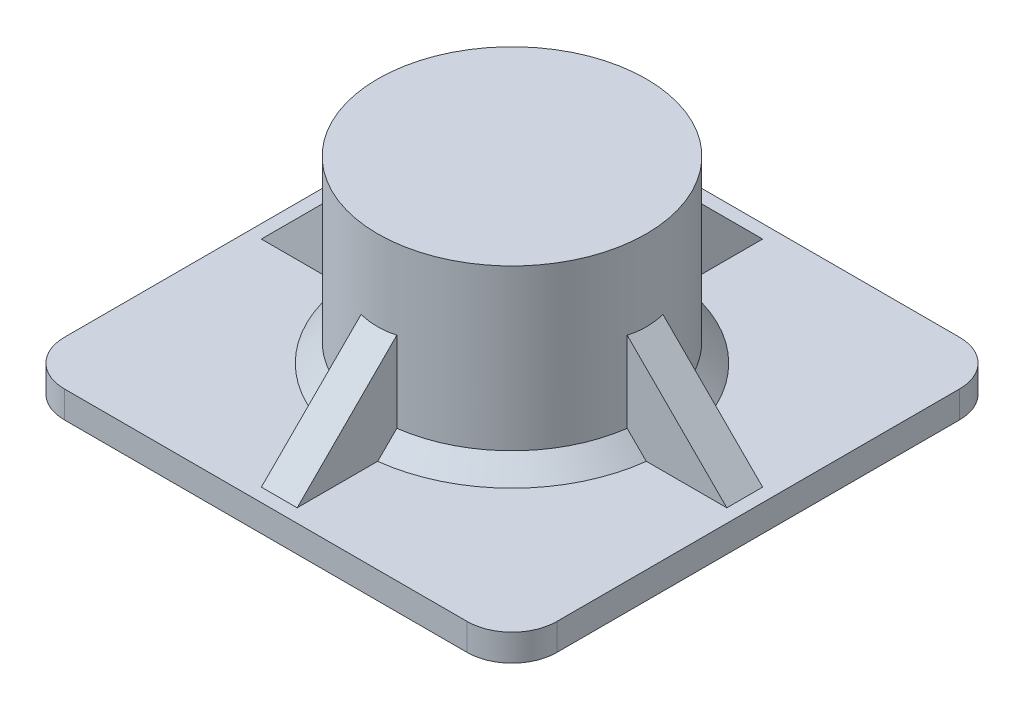
ISO-10303-21;
HEADER;
FILE_DESCRIPTION(('STEP AP214'),'2;1');
FILE_NAME('part.step','',(''),(''),'','','');
FILE_SCHEMA(('AUTOMOTIVE_DESIGN { 1 0 10303 214 1 1 1 1 }'));
ENDSEC;
DATA;
#1=APPLICATION_CONTEXT('core data for automotive mechanical design processes');
#2=APPLICATION_PROTOCOL_DEFINITION('international standard','automotive_design',2000,#1);
#3=PRODUCT_CONTEXT('',#1,'mechanical');
#4=PRODUCT('Part','Part','',(#3));
#5=PRODUCT_RELATED_PRODUCT_CATEGORY('part','',(#4));
#6=PRODUCT_DEFINITION_FORMATION('','',#4);
#7=PRODUCT_DEFINITION_CONTEXT('part definition',#1,'design');
#8=PRODUCT_DEFINITION('design','',#6,#7);
#9=PRODUCT_DEFINITION_SHAPE('','',#8);
#10=(LENGTH_UNIT() NAMED_UNIT(*) SI_UNIT(.MILLI.,.METRE.));
#11=(NAMED_UNIT(*) PLANE_ANGLE_UNIT() SI_UNIT($,.RADIAN.));
#12=(NAMED_UNIT(*) SI_UNIT($,.STERADIAN.) SOLID_ANGLE_UNIT());
#13=UNCERTAINTY_MEASURE_WITH_UNIT(LENGTH_MEASURE(1.E-05),#10,'distance_accuracy_value','');
#14=(GEOMETRIC_REPRESENTATION_CONTEXT(3) GLOBAL_UNCERTAINTY_ASSIGNED_CONTEXT((#13)) GLOBAL_UNIT_ASSIGNED_CONTEXT((#10,
#11,#12)) REPRESENTATION_CONTEXT('',''));
#15=CARTESIAN_POINT('',(0.,0.,0.));
#16=DIRECTION('',(0.,0.,1.));
#17=DIRECTION('',(1.,0.,0.));
#18=AXIS2_PLACEMENT_3D('',#15,#16,#17);
#19=CARTESIAN_POINT('',(0.,3.00000000000001,0.));
#20=DIRECTION('',(0.,-1.,0.));
#21=DIRECTION('',(1.,0.,0.));
#22=AXIS2_PLACEMENT_3D('',#19,#20,#21);
#23=CONICAL_SURFACE('',#22,17.1213203435597,0.785398163397456);
#24=CARTESIAN_POINT('',(0.,3.00000000000001,0.));
#25=DIRECTION('',(0.,-1.,0.));
#26=DIRECTION('',(1.,0.,0.));
#27=AXIS2_PLACEMENT_3D('',#24,#25,#26);
#28=CIRCLE('',#27,17.1213203435597);
#29=CARTESIAN_POINT('',(17.0041056897089,3.,1.99999999999982));
#30=VERTEX_POINT('',#29);
#31=CARTESIAN_POINT('',(2.,3.,17.0041056897089));
#32=VERTEX_POINT('',#31);
#33=EDGE_CURVE('E326',#30,#32,#28,.T.);
#34=ORIENTED_EDGE('',*,*,#33,.F.);
#35=CARTESIAN_POINT('',(24.4704840193555,-4.43075875662093,1.99999999999975));
#36=CARTESIAN_POINT('',(23.7577585880787,-3.72041255396887,1.99999999999975));
#37=CARTESIAN_POINT('',(23.0449401740618,-3.01015957482214,1.99999999999976));
#38=CARTESIAN_POINT('',(21.6190310504559,-1.58992853041443,1.99999999999977));
#39=CARTESIAN_POINT('',(20.9059403411578,-0.879950464861503,1.99999999999978));
#40=CARTESIAN_POINT('',(19.4794050823854,0.539637526369911,1.9999999999998));
#41=CARTESIAN_POINT('',(18.7659605360936,1.24924745524615,1.9999999999998));
#42=CARTESIAN_POINT('',(17.3385675093448,2.66796212109999,1.99999999999982));
#43=CARTESIAN_POINT('',(16.624619028283,3.37706685746911,1.99999999999982));
#44=CARTESIAN_POINT('',(15.195981751318,4.79454899453409,1.99999999999984));
#45=CARTESIAN_POINT('',(14.4812929458421,5.50292638558325,1.99999999999985));
#46=CARTESIAN_POINT('',(13.0508088563277,6.91855994664566,1.99999999999986));
#47=CARTESIAN_POINT('',(12.3350135754003,7.62581611980031,1.99999999999987));
#48=CARTESIAN_POINT('',(11.2599343610059,8.68530291970566,1.99999999999988));
#49=CARTESIAN_POINT('',(10.9013413336474,9.03823447278028,1.99999999999988));
#50=CARTESIAN_POINT('',(10.1835346571394,9.74346505262556,1.99999999999989));
#51=CARTESIAN_POINT('',(9.82432100885987,10.0957640802814,1.99999999999989));
#52=CARTESIAN_POINT('',(9.10504491264282,10.7995022581127,1.9999999999999));
#53=CARTESIAN_POINT('',(8.7449824564977,11.150941399906,1.9999999999999));
#54=CARTESIAN_POINT('',(8.20398500605128,11.6771728459573,1.99999999999991));
#55=CARTESIAN_POINT('',(8.02350146683888,11.8524291970287,1.99999999999991));
#56=CARTESIAN_POINT('',(7.66216331556021,12.202559416186,1.99999999999992));
#57=CARTESIAN_POINT('',(7.48130870296099,12.3774332837217,1.99999999999992));
#58=CARTESIAN_POINT('',(7.3002337634126,12.5520791001806,1.99999999999992));
#59=B_SPLINE_CURVE_WITH_KNOTS('',3,(#35,#36,#37,#38,#39,#40,#41,#42,#43,#44,#45,#46,#47,#48,#49,
#50,#51,#52,#53,#54,#55,#56,#57,#58),.UNSPECIFIED.,.F.,.F.,(4,2,2,2,2,2,2,2,2,2,2,4),(0.,
3.01879509437756,6.03758697406484,9.05635217714024,12.0751210099704,15.0939293761665,
18.112729269347,19.6221480405556,21.1315646978969,22.6409960110398,23.3957152383859,
24.150435550425),.UNSPECIFIED.);
#60=CARTESIAN_POINT('',(14.8660687473185,5.12132034355963,1.99999999999984));
#61=VERTEX_POINT('',#60);
#62=EDGE_CURVE('E211',#30,#61,#59,.T.);
#63=ORIENTED_EDGE('',*,*,#62,.T.);
#64=CARTESIAN_POINT('',(0.,5.12132034355963,0.));
#65=DIRECTION('',(0.,-1.,0.));
#66=DIRECTION('',(1.,0.,0.));
#67=AXIS2_PLACEMENT_3D('',#64,#65,#66);
#68=CIRCLE('',#67,15.);
#69=CARTESIAN_POINT('',(2.,5.12132034355963,14.8660687473185));
#70=VERTEX_POINT('',#69);
#71=EDGE_CURVE('E332',#61,#70,#68,.T.);
#72=ORIENTED_EDGE('',*,*,#71,.T.);
#73=CARTESIAN_POINT('',(2.,-4.43075875662096,24.4704840193555));
#74=CARTESIAN_POINT('',(2.,-3.7204125539689,23.7577585880788));
#75=CARTESIAN_POINT('',(2.,-3.01015957482217,23.0449401740618));
#76=CARTESIAN_POINT('',(2.,-1.58992853041445,21.6190310504559));
#77=CARTESIAN_POINT('',(2.,-0.879950464861521,20.9059403411578));
#78=CARTESIAN_POINT('',(2.,0.539637526369898,19.4794050823854));
#79=CARTESIAN_POINT('',(2.,1.24924745524614,18.7659605360936));
#80=CARTESIAN_POINT('',(2.,2.66796212109998,17.3385675093448));
#81=CARTESIAN_POINT('',(2.,3.37706685746911,16.624619028283));
#82=CARTESIAN_POINT('',(2.,4.7945489945341,15.195981751318));
#83=CARTESIAN_POINT('',(2.,5.50292638558326,14.4812929458421));
#84=CARTESIAN_POINT('',(2.,6.91855994664567,13.0508088563277));
#85=CARTESIAN_POINT('',(2.00000000000001,7.62581611980032,12.3350135754002));
#86=CARTESIAN_POINT('',(2.00000000000001,8.68530291970568,11.2599343610059));
#87=CARTESIAN_POINT('',(2.00000000000001,9.0382344727803,10.9013413336474));
#88=CARTESIAN_POINT('',(2.00000000000001,9.74346505262558,10.1835346571394));
#89=CARTESIAN_POINT('',(2.00000000000001,10.0957640802814,9.82432100885984));
#90=CARTESIAN_POINT('',(2.00000000000001,10.7995022581127,9.10504491264279));
#91=CARTESIAN_POINT('',(2.00000000000001,11.150941399906,8.74498245649766));
#92=CARTESIAN_POINT('',(2.00000000000001,11.6771728459573,8.20398500605123));
#93=CARTESIAN_POINT('',(2.00000000000001,11.8524291970287,8.02350146683884));
#94=CARTESIAN_POINT('',(2.00000000000001,12.202559416186,7.66216331556016));
#95=CARTESIAN_POINT('',(2.00000000000001,12.3774332837218,7.48130870296094));
#96=CARTESIAN_POINT('',(2.00000000000001,12.5520791001806,7.30023376341255));
#97=B_SPLINE_CURVE_WITH_KNOTS('',3,(#73,#74,#75,#76,#77,#78,#79,#80,#81,#82,#83,#84,#85,#86,#87,
#88,#89,#90,#91,#92,#93,#94,#95,#96),.UNSPECIFIED.,.F.,.F.,(4,2,2,2,2,2,2,2,2,2,2,4),(0.,
3.01879509437758,6.03758697406487,9.05635217714027,12.0751210099705,15.0939293761665,
18.1127292693471,19.6221480405557,21.131564697897,22.6409960110399,23.395715238386,
24.1504355504251),.UNSPECIFIED.);
#98=EDGE_CURVE('E416',#32,#70,#97,.T.);
#99=ORIENTED_EDGE('',*,*,#98,.F.);
#100=EDGE_LOOP('',(#34,#63,#72,#99));
#101=FACE_BOUND('',#100,.T.);
#102=ADVANCED_FACE('F42',(#101),#23,.T.);
#103=CARTESIAN_POINT('',(-2.,3.,17.0041056897089));
#104=VERTEX_POINT('',#103);
#105=CARTESIAN_POINT('',(-17.0041056897089,3.00000000000001,2.00000000000006));
#106=VERTEX_POINT('',#105);
#107=EDGE_CURVE('E419',#104,#106,#28,.T.);
#108=ORIENTED_EDGE('',*,*,#107,.F.);
#109=CARTESIAN_POINT('',(-2.,-4.43075875662096,24.4704840193555));
#110=CARTESIAN_POINT('',(-2.,-3.7204125539689,23.7577585880788));
#111=CARTESIAN_POINT('',(-2.,-3.01015957482217,23.0449401740618));
#112=CARTESIAN_POINT('',(-2.,-1.58992853041445,21.6190310504559));
#113=CARTESIAN_POINT('',(-2.,-0.879950464861523,20.9059403411578));
#114=CARTESIAN_POINT('',(-2.,0.539637526369897,19.4794050823854));
#115=CARTESIAN_POINT('',(-2.,1.24924745524614,18.7659605360936));
#116=CARTESIAN_POINT('',(-2.,2.66796212109998,17.3385675093448));
#117=CARTESIAN_POINT('',(-2.,3.37706685746911,16.624619028283));
#118=CARTESIAN_POINT('',(-2.,4.7945489945341,15.195981751318));
#119=CARTESIAN_POINT('',(-2.,5.50292638558325,14.4812929458421));
#120=CARTESIAN_POINT('',(-2.,6.91855994664566,13.0508088563277));
#121=CARTESIAN_POINT('',(-1.99999999999999,7.62581611980031,12.3350135754003));
#122=CARTESIAN_POINT('',(-1.99999999999999,8.68530291970568,11.2599343610059));
#123=CARTESIAN_POINT('',(-1.99999999999999,9.0382344727803,10.9013413336474));
#124=CARTESIAN_POINT('',(-1.99999999999999,9.74346505262558,10.1835346571394));
#125=CARTESIAN_POINT('',(-1.99999999999999,10.0957640802814,9.82432100885984));
#126=CARTESIAN_POINT('',(-1.99999999999999,10.7995022581127,9.10504491264279));
#127=CARTESIAN_POINT('',(-1.99999999999999,11.150941399906,8.74498245649767));
#128=CARTESIAN_POINT('',(-1.99999999999999,11.6771728459573,8.20398500605124));
#129=CARTESIAN_POINT('',(-1.99999999999999,11.8524291970287,8.02350146683884));
#130=CARTESIAN_POINT('',(-1.99999999999999,12.202559416186,7.66216331556017));
#131=CARTESIAN_POINT('',(-1.99999999999999,12.3774332837217,7.48130870296095));
#132=CARTESIAN_POINT('',(-1.99999999999999,12.5520791001806,7.30023376341255));
#133=B_SPLINE_CURVE_WITH_KNOTS('',3,(#109,#110,#111,#112,#113,#114,#115,#116,#117,#118,#119,
#120,#121,#122,#123,#124,#125,#126,#127,#128,#129,#130,#131,#132),.UNSPECIFIED.,.F.,.F.,(4,2,2,
2,2,2,2,2,2,2,2,4),(0.,3.01879509437757,6.03758697406486,9.05635217714027,12.0751210099705,
15.0939293761665,18.1127292693471,19.6221480405557,21.131564697897,22.6409960110399,
23.395715238386,24.1504355504251),.UNSPECIFIED.);
#134=CARTESIAN_POINT('',(-2.,5.12132034355963,14.8660687473185));
#135=VERTEX_POINT('',#134);
#136=EDGE_CURVE('E484',#104,#135,#133,.T.);
#137=ORIENTED_EDGE('',*,*,#136,.T.);
#138=CARTESIAN_POINT('',(-14.8660687473185,5.12132034355964,2.00000000000005));
#139=VERTEX_POINT('',#138);
#140=EDGE_CURVE('E481',#135,#139,#68,.T.);
#141=ORIENTED_EDGE('',*,*,#140,.T.);
#142=CARTESIAN_POINT('',(-24.4704840193555,-4.43075875662098,2.00000000000008));
#143=CARTESIAN_POINT('',(-23.7577585880788,-3.72041255396892,2.00000000000008));
#144=CARTESIAN_POINT('',(-23.0449401740618,-3.01015957482218,2.00000000000008));
#145=CARTESIAN_POINT('',(-21.6190310504559,-1.58992853041447,2.00000000000008));
#146=CARTESIAN_POINT('',(-20.9059403411578,-0.879950464861533,2.00000000000007));
#147=CARTESIAN_POINT('',(-19.4794050823854,0.53963752636989,2.00000000000007));
#148=CARTESIAN_POINT('',(-18.7659605360936,1.24924745524614,2.00000000000007));
#149=CARTESIAN_POINT('',(-17.3385675093449,2.66796212109998,2.00000000000006));
#150=CARTESIAN_POINT('',(-16.624619028283,3.37706685746911,2.00000000000006));
#151=CARTESIAN_POINT('',(-15.195981751318,4.7945489945341,2.00000000000005));
#152=CARTESIAN_POINT('',(-14.4812929458421,5.50292638558326,2.00000000000005));
#153=CARTESIAN_POINT('',(-13.0508088563277,6.91855994664567,2.00000000000005));
#154=CARTESIAN_POINT('',(-12.3350135754002,7.62581611980032,2.00000000000005));
#155=CARTESIAN_POINT('',(-11.2599343610059,8.68530291970569,2.00000000000004));
#156=CARTESIAN_POINT('',(-10.9013413336474,9.03823447278031,2.00000000000004));
#157=CARTESIAN_POINT('',(-10.1835346571394,9.7434650526256,2.00000000000004));
#158=CARTESIAN_POINT('',(-9.82432100885983,10.0957640802814,2.00000000000004));
#159=CARTESIAN_POINT('',(-9.10504491264277,10.7995022581127,2.00000000000004));
#160=CARTESIAN_POINT('',(-8.74498245649765,11.150941399906,2.00000000000003));
#161=CARTESIAN_POINT('',(-8.20398500605122,11.6771728459573,2.00000000000003));
#162=CARTESIAN_POINT('',(-8.02350146683882,11.8524291970287,2.00000000000003));
#163=CARTESIAN_POINT('',(-7.66216331556014,12.202559416186,2.00000000000003));
#164=CARTESIAN_POINT('',(-7.48130870296092,12.3774332837218,2.00000000000003));
#165=CARTESIAN_POINT('',(-7.30023376341253,12.5520791001806,2.00000000000003));
#166=B_SPLINE_CURVE_WITH_KNOTS('',3,(#142,#143,#144,#145,#146,#147,#148,#149,#150,#151,#152,
#153,#154,#155,#156,#157,#158,#159,#160,#161,#162,#163,#164,#165),.UNSPECIFIED.,.F.,.F.,(4,2,2,
2,2,2,2,2,2,2,2,4),(0.,3.01879509437758,6.03758697406488,9.0563521771403,12.0751210099705,
15.0939293761666,18.1127292693471,19.6221480405558,21.131564697897,22.64099601104,
23.3957152383861,24.1504355504251),.UNSPECIFIED.);
#167=EDGE_CURVE('E442',#106,#139,#166,.T.);
#168=ORIENTED_EDGE('',*,*,#167,.F.);
#169=EDGE_LOOP('',(#108,#137,#141,#168));
#170=FACE_BOUND('',#169,.T.);
#171=ADVANCED_FACE('F407',(#170),#23,.T.);
#172=CARTESIAN_POINT('',(-17.0041056897089,3.00000000000001,-1.99999999999994));
#173=VERTEX_POINT('',#172);
#174=CARTESIAN_POINT('',(-2.,3.,-17.0041056897089));
#175=VERTEX_POINT('',#174);
#176=EDGE_CURVE('E321',#173,#175,#28,.T.);
#177=ORIENTED_EDGE('',*,*,#176,.F.);
#178=CARTESIAN_POINT('',(-24.4704840193555,-4.43075875662097,-1.99999999999992));
#179=CARTESIAN_POINT('',(-23.7577585880788,-3.7204125539689,-1.99999999999992));
#180=CARTESIAN_POINT('',(-23.0449401740618,-3.01015957482217,-1.99999999999992));
#181=CARTESIAN_POINT('',(-21.6190310504559,-1.58992853041445,-1.99999999999992));
#182=CARTESIAN_POINT('',(-20.9059403411578,-0.879950464861526,-1.99999999999993));
#183=CARTESIAN_POINT('',(-19.4794050823854,0.539637526369894,-1.99999999999993));
#184=CARTESIAN_POINT('',(-18.7659605360936,1.24924745524614,-1.99999999999993));
#185=CARTESIAN_POINT('',(-17.3385675093449,2.66796212109998,-1.99999999999994));
#186=CARTESIAN_POINT('',(-16.624619028283,3.37706685746911,-1.99999999999994));
#187=CARTESIAN_POINT('',(-15.195981751318,4.7945489945341,-1.99999999999995));
#188=CARTESIAN_POINT('',(-14.4812929458421,5.50292638558325,-1.99999999999995));
#189=CARTESIAN_POINT('',(-13.0508088563277,6.91855994664567,-1.99999999999995));
#190=CARTESIAN_POINT('',(-12.3350135754003,7.62581611980032,-1.99999999999995));
#191=CARTESIAN_POINT('',(-11.2599343610059,8.68530291970568,-1.99999999999996));
#192=CARTESIAN_POINT('',(-10.9013413336474,9.0382344727803,-1.99999999999996));
#193=CARTESIAN_POINT('',(-10.1835346571394,9.74346505262558,-1.99999999999996));
#194=CARTESIAN_POINT('',(-9.82432100885986,10.0957640802814,-1.99999999999996));
#195=CARTESIAN_POINT('',(-9.1050449126428,10.7995022581127,-1.99999999999996));
#196=CARTESIAN_POINT('',(-8.74498245649768,11.150941399906,-1.99999999999997));
#197=CARTESIAN_POINT('',(-8.20398500605125,11.6771728459573,-1.99999999999997));
#198=CARTESIAN_POINT('',(-8.02350146683885,11.8524291970287,-1.99999999999997));
#199=CARTESIAN_POINT('',(-7.66216331556017,12.202559416186,-1.99999999999997));
#200=CARTESIAN_POINT('',(-7.48130870296096,12.3774332837218,-1.99999999999997));
#201=CARTESIAN_POINT('',(-7.30023376341256,12.5520791001806,-1.99999999999997));
#202=B_SPLINE_CURVE_WITH_KNOTS('',3,(#178,#179,#180,#181,#182,#183,#184,#185,#186,#187,#188,
#189,#190,#191,#192,#193,#194,#195,#196,#197,#198,#199,#200,#201),.UNSPECIFIED.,.F.,.F.,(4,2,2,
2,2,2,2,2,2,2,2,4),(0.,3.01879509437758,6.03758697406487,9.05635217714028,12.0751210099705,
15.0939293761665,18.1127292693471,19.6221480405557,21.131564697897,22.6409960110399,
23.395715238386,24.1504355504251),.UNSPECIFIED.);
#203=CARTESIAN_POINT('',(-14.8660687473185,5.12132034355964,-1.99999999999995));
#204=VERTEX_POINT('',#203);
#205=EDGE_CURVE('E438',#173,#204,#202,.T.);
#206=ORIENTED_EDGE('',*,*,#205,.T.);
#207=CARTESIAN_POINT('',(-2.,5.12132034355963,-14.8660687473185));
#208=VERTEX_POINT('',#207);
#209=EDGE_CURVE('E325',#204,#208,#68,.T.);
#210=ORIENTED_EDGE('',*,*,#209,.T.);
#211=CARTESIAN_POINT('',(-2.,-4.43075875662097,-24.4704840193555));
#212=CARTESIAN_POINT('',(-2.,-3.7204125539689,-23.7577585880788));
#213=CARTESIAN_POINT('',(-2.,-3.01015957482217,-23.0449401740618));
#214=CARTESIAN_POINT('',(-2.,-1.58992853041446,-21.6190310504559));
#215=CARTESIAN_POINT('',(-2.,-0.879950464861525,-20.9059403411578));
#216=CARTESIAN_POINT('',(-2.,0.539637526369894,-19.4794050823854));
#217=CARTESIAN_POINT('',(-2.,1.24924745524614,-18.7659605360936));
#218=CARTESIAN_POINT('',(-2.,2.66796212109998,-17.3385675093448));
#219=CARTESIAN_POINT('',(-2.,3.37706685746911,-16.624619028283));
#220=CARTESIAN_POINT('',(-2.,4.7945489945341,-15.195981751318));
#221=CARTESIAN_POINT('',(-2.,5.50292638558325,-14.4812929458421));
#222=CARTESIAN_POINT('',(-2.,6.91855994664566,-13.0508088563277));
#223=CARTESIAN_POINT('',(-2.,7.62581611980031,-12.3350135754002));
#224=CARTESIAN_POINT('',(-2.,8.68530291970568,-11.2599343610059));
#225=CARTESIAN_POINT('',(-2.,9.0382344727803,-10.9013413336474));
#226=CARTESIAN_POINT('',(-2.,9.74346505262558,-10.1835346571394));
#227=CARTESIAN_POINT('',(-2.,10.0957640802814,-9.82432100885984));
#228=CARTESIAN_POINT('',(-2.,10.7995022581127,-9.10504491264279));
#229=CARTESIAN_POINT('',(-2.,11.150941399906,-8.74498245649766));
#230=CARTESIAN_POINT('',(-2.,11.6771728459573,-8.20398500605124));
#231=CARTESIAN_POINT('',(-2.,11.8524291970287,-8.02350146683884));
#232=CARTESIAN_POINT('',(-2.,12.202559416186,-7.66216331556016));
#233=CARTESIAN_POINT('',(-2.,12.3774332837218,-7.48130870296094));
#234=CARTESIAN_POINT('',(-2.,12.5520791001806,-7.30023376341255));
#235=B_SPLINE_CURVE_WITH_KNOTS('',3,(#211,#212,#213,#214,#215,#216,#217,#218,#219,#220,#221,
#222,#223,#224,#225,#226,#227,#228,#229,#230,#231,#232,#233,#234),.UNSPECIFIED.,.F.,.F.,(4,2,2,
2,2,2,2,2,2,2,2,4),(0.,3.01879509437758,6.03758697406487,9.05635217714028,12.0751210099705,
15.0939293761665,18.1127292693471,19.6221480405557,21.131564697897,22.6409960110399,
23.395715238386,24.1504355504251),.UNSPECIFIED.);
#236=EDGE_CURVE('E375',#175,#208,#235,.T.);
#237=ORIENTED_EDGE('',*,*,#236,.F.);
#238=EDGE_LOOP('',(#177,#206,#210,#237));
#239=FACE_BOUND('',#238,.T.);
#240=ADVANCED_FACE('F405',(#239),#23,.T.);
#241=CARTESIAN_POINT('',(-27.5,3.,-27.5));
#242=DIRECTION('',(1.,0.,0.));
#243=DIRECTION('',(0.,0.,-1.));
#244=AXIS2_PLACEMENT_3D('',#241,#242,#243);
#245=PLANE('',#244);
#246=DIRECTION('',(0.,0.,1.));
#247=VECTOR('',#246,1.);
#248=CARTESIAN_POINT('',(-27.5,0.,-27.5));
#249=LINE('',#248,#247);
#250=CARTESIAN_POINT('',(-27.5,0.,-22.5));
#251=VERTEX_POINT('',#250);
#252=CARTESIAN_POINT('',(-27.5,0.,22.5));
#253=VERTEX_POINT('',#252);
#254=EDGE_CURVE('E336',#251,#253,#249,.T.);
#255=ORIENTED_EDGE('',*,*,#254,.T.);
#256=DIRECTION('',(0.,-1.,0.));
#257=VECTOR('',#256,1.);
#258=CARTESIAN_POINT('',(-27.5,3.,22.5));
#259=LINE('',#258,#257);
#260=CARTESIAN_POINT('',(-27.5,3.,22.5));
#261=VERTEX_POINT('',#260);
#262=EDGE_CURVE('E577',#253,#261,#259,.F.);
#263=ORIENTED_EDGE('',*,*,#262,.T.);
#264=DIRECTION('',(0.,0.,1.));
#265=VECTOR('',#264,1.);
#266=CARTESIAN_POINT('',(-27.5,3.,-27.5));
#267=LINE('',#266,#265);
#268=CARTESIAN_POINT('',(-27.5,3.,-22.5));
#269=VERTEX_POINT('',#268);
#270=EDGE_CURVE('E337',#269,#261,#267,.T.);
#271=ORIENTED_EDGE('',*,*,#270,.F.);
#272=DIRECTION('',(0.,-1.,0.));
#273=VECTOR('',#272,1.);
#274=CARTESIAN_POINT('',(-27.5,3.,-22.5));
#275=LINE('',#274,#273);
#276=EDGE_CURVE('E573',#269,#251,#275,.T.);
#277=ORIENTED_EDGE('',*,*,#276,.T.);
#278=EDGE_LOOP('',(#255,#263,#271,#277));
#279=FACE_BOUND('',#278,.T.);
#280=ADVANCED_FACE('F621',(#279),#245,.F.);
#281=CARTESIAN_POINT('',(27.5,3.,27.5));
#282=DIRECTION('',(0.,0.,-1.));
#283=DIRECTION('',(-1.,0.,0.));
#284=AXIS2_PLACEMENT_3D('',#281,#282,#283);
#285=PLANE('',#284);
#286=DIRECTION('',(1.,0.,0.));
#287=VECTOR('',#286,1.);
#288=CARTESIAN_POINT('',(27.5,3.,27.5));
#289=LINE('',#288,#287);
#290=CARTESIAN_POINT('',(-22.5,3.,27.5));
#291=VERTEX_POINT('',#290);
#292=CARTESIAN_POINT('',(22.5,3.,27.5));
#293=VERTEX_POINT('',#292);
#294=EDGE_CURVE('E341',#291,#293,#289,.T.);
#295=ORIENTED_EDGE('',*,*,#294,.F.);
#296=DIRECTION('',(0.,-1.,0.));
#297=VECTOR('',#296,1.);
#298=CARTESIAN_POINT('',(-22.5,3.,27.5));
#299=LINE('',#298,#297);
#300=CARTESIAN_POINT('',(-22.5,0.,27.5));
#301=VERTEX_POINT('',#300);
#302=EDGE_CURVE('E555',#291,#301,#299,.T.);
#303=ORIENTED_EDGE('',*,*,#302,.T.);
#304=DIRECTION('',(1.,0.,0.));
#305=VECTOR('',#304,1.);
#306=CARTESIAN_POINT('',(27.5,0.,27.5));
#307=LINE('',#306,#305);
#308=CARTESIAN_POINT('',(22.5,0.,27.5));
#309=VERTEX_POINT('',#308);
#310=EDGE_CURVE('E356',#301,#309,#307,.T.);
#311=ORIENTED_EDGE('',*,*,#310,.T.);
#312=DIRECTION('',(0.,-1.,0.));
#313=VECTOR('',#312,1.);
#314=CARTESIAN_POINT('',(22.5,3.,27.5));
#315=LINE('',#314,#313);
#316=EDGE_CURVE('E553',#309,#293,#315,.F.);
#317=ORIENTED_EDGE('',*,*,#316,.T.);
#318=EDGE_LOOP('',(#295,#303,#311,#317));
#319=FACE_BOUND('',#318,.T.);
#320=ADVANCED_FACE('F628',(#319),#285,.F.);
#321=CARTESIAN_POINT('',(27.5,3.,-27.5));
#322=DIRECTION('',(-1.,0.,0.));
#323=DIRECTION('',(0.,0.,1.));
#324=AXIS2_PLACEMENT_3D('',#321,#322,#323);
#325=PLANE('',#324);
#326=DIRECTION('',(0.,0.,-1.));
#327=VECTOR('',#326,1.);
#328=CARTESIAN_POINT('',(27.5,0.,-27.5));
#329=LINE('',#328,#327);
#330=CARTESIAN_POINT('',(27.5,0.,22.5));
#331=VERTEX_POINT('',#330);
#332=CARTESIAN_POINT('',(27.5,0.,-22.5));
#333=VERTEX_POINT('',#332);
#334=EDGE_CURVE('E360',#331,#333,#329,.T.);
#335=ORIENTED_EDGE('',*,*,#334,.T.);
#336=DIRECTION('',(0.,-1.,0.));
#337=VECTOR('',#336,1.);
#338=CARTESIAN_POINT('',(27.5,3.,-22.5));
#339=LINE('',#338,#337);
#340=CARTESIAN_POINT('',(27.5,3.,-22.5));
#341=VERTEX_POINT('',#340);
#342=EDGE_CURVE('E11',#333,#341,#339,.F.);
#343=ORIENTED_EDGE('',*,*,#342,.T.);
#344=DIRECTION('',(0.,0.,-1.));
#345=VECTOR('',#344,1.);
#346=CARTESIAN_POINT('',(27.5,3.,-27.5));
#347=LINE('',#346,#345);
#348=CARTESIAN_POINT('',(27.5,3.,22.5));
#349=VERTEX_POINT('',#348);
#350=EDGE_CURVE('E346',#349,#341,#347,.T.);
#351=ORIENTED_EDGE('',*,*,#350,.F.);
#352=DIRECTION('',(0.,-1.,0.));
#353=VECTOR('',#352,1.);
#354=CARTESIAN_POINT('',(27.5,3.,22.5));
#355=LINE('',#354,#353);
#356=EDGE_CURVE('E51',#349,#331,#355,.T.);
#357=ORIENTED_EDGE('',*,*,#356,.T.);
#358=EDGE_LOOP('',(#335,#343,#351,#357));
#359=FACE_BOUND('',#358,.T.);
#360=ADVANCED_FACE('F602',(#359),#325,.F.);
#361=CARTESIAN_POINT('',(27.5,3.,-27.5));
#362=DIRECTION('',(0.,0.,1.));
#363=DIRECTION('',(1.,0.,0.));
#364=AXIS2_PLACEMENT_3D('',#361,#362,#363);
#365=PLANE('',#364);
#366=DIRECTION('',(-1.,0.,0.));
#367=VECTOR('',#366,1.);
#368=CARTESIAN_POINT('',(27.5,0.,-27.5));
#369=LINE('',#368,#367);
#370=CARTESIAN_POINT('',(22.5,0.,-27.5));
#371=VERTEX_POINT('',#370);
#372=CARTESIAN_POINT('',(-22.5,0.,-27.5));
#373=VERTEX_POINT('',#372);
#374=EDGE_CURVE('E342',#371,#373,#369,.T.);
#375=ORIENTED_EDGE('',*,*,#374,.T.);
#376=DIRECTION('',(0.,-1.,0.));
#377=VECTOR('',#376,1.);
#378=CARTESIAN_POINT('',(-22.5,3.,-27.5));
#379=LINE('',#378,#377);
#380=CARTESIAN_POINT('',(-22.5,3.,-27.5));
#381=VERTEX_POINT('',#380);
#382=EDGE_CURVE('E58',#373,#381,#379,.F.);
#383=ORIENTED_EDGE('',*,*,#382,.T.);
#384=DIRECTION('',(-1.,0.,0.));
#385=VECTOR('',#384,1.);
#386=CARTESIAN_POINT('',(27.5,3.,-27.5));
#387=LINE('',#386,#385);
#388=CARTESIAN_POINT('',(22.5,3.,-27.5));
#389=VERTEX_POINT('',#388);
#390=EDGE_CURVE('E349',#389,#381,#387,.T.);
#391=ORIENTED_EDGE('',*,*,#390,.F.);
#392=DIRECTION('',(0.,-1.,0.));
#393=VECTOR('',#392,1.);
#394=CARTESIAN_POINT('',(22.5,3.,-27.5));
#395=LINE('',#394,#393);
#396=EDGE_CURVE('E591',#389,#371,#395,.T.);
#397=ORIENTED_EDGE('',*,*,#396,.T.);
#398=EDGE_LOOP('',(#375,#383,#391,#397));
#399=FACE_BOUND('',#398,.T.);
#400=ADVANCED_FACE('F613',(#399),#365,.F.);
#401=CARTESIAN_POINT('',(0.,3.,0.));
#402=DIRECTION('',(0.,-1.,0.));
#403=DIRECTION('',(0.,0.,-1.));
#404=AXIS2_PLACEMENT_3D('',#401,#402,#403);
#405=PLANE('',#404);
#406=CARTESIAN_POINT('',(2.,3.,-17.0041056897089));
#407=VERTEX_POINT('',#406);
#408=CARTESIAN_POINT('',(17.0041056897089,3.,-2.00000000000018));
#409=VERTEX_POINT('',#408);
#410=EDGE_CURVE('E322',#407,#409,#28,.T.);
#411=ORIENTED_EDGE('',*,*,#410,.T.);
#412=DIRECTION('',(1.,0.,0.));
#413=VECTOR('',#412,1.);
#414=CARTESIAN_POINT('',(26.0000000000002,2.99999999999999,-2.00000000000027));
#415=LINE('',#414,#413);
#416=CARTESIAN_POINT('',(26.0000000000002,2.99999999999999,-2.00000000000027));
#417=VERTEX_POINT('',#416);
#418=EDGE_CURVE('E225',#409,#417,#415,.T.);
#419=ORIENTED_EDGE('',*,*,#418,.T.);
#420=DIRECTION('',(0.,0.,1.));
#421=VECTOR('',#420,1.);
#422=CARTESIAN_POINT('',(26.0000000000002,2.99999999999999,-2.00000000000027));
#423=LINE('',#422,#421);
#424=CARTESIAN_POINT('',(26.0000000000002,2.99999999999999,1.99999999999973));
#425=VERTEX_POINT('',#424);
#426=EDGE_CURVE('E220',#417,#425,#423,.T.);
#427=ORIENTED_EDGE('',*,*,#426,.T.);
#428=DIRECTION('',(1.,0.,0.));
#429=VECTOR('',#428,1.);
#430=CARTESIAN_POINT('',(26.0000000000002,2.99999999999999,1.99999999999973));
#431=LINE('',#430,#429);
#432=EDGE_CURVE('E205',#30,#425,#431,.T.);
#433=ORIENTED_EDGE('',*,*,#432,.F.);
#434=ORIENTED_EDGE('',*,*,#33,.T.);
#435=DIRECTION('',(0.,0.,1.));
#436=VECTOR('',#435,1.);
#437=CARTESIAN_POINT('',(2.,3.,26.0000000000002));
#438=LINE('',#437,#436);
#439=CARTESIAN_POINT('',(2.,3.,26.0000000000002));
#440=VERTEX_POINT('',#439);
#441=EDGE_CURVE('E250',#32,#440,#438,.T.);
#442=ORIENTED_EDGE('',*,*,#441,.T.);
#443=DIRECTION('',(-1.,0.,0.));
#444=VECTOR('',#443,1.);
#445=CARTESIAN_POINT('',(2.,3.,26.0000000000002));
#446=LINE('',#445,#444);
#447=CARTESIAN_POINT('',(-2.,3.,26.0000000000002));
#448=VERTEX_POINT('',#447);
#449=EDGE_CURVE('E258',#440,#448,#446,.T.);
#450=ORIENTED_EDGE('',*,*,#449,.T.);
#451=DIRECTION('',(0.,0.,1.));
#452=VECTOR('',#451,1.);
#453=CARTESIAN_POINT('',(-2.,3.,26.0000000000002));
#454=LINE('',#453,#452);
#455=EDGE_CURVE('E243',#104,#448,#454,.T.);
#456=ORIENTED_EDGE('',*,*,#455,.F.);
#457=ORIENTED_EDGE('',*,*,#107,.T.);
#458=DIRECTION('',(-1.,0.,0.));
#459=VECTOR('',#458,1.);
#460=CARTESIAN_POINT('',(-26.0000000000002,3.00000000000001,2.00000000000009));
#461=LINE('',#460,#459);
#462=CARTESIAN_POINT('',(-26.0000000000002,3.00000000000001,2.00000000000009));
#463=VERTEX_POINT('',#462);
#464=EDGE_CURVE('E276',#106,#463,#461,.T.);
#465=ORIENTED_EDGE('',*,*,#464,.T.);
#466=DIRECTION('',(0.,0.,-1.));
#467=VECTOR('',#466,1.);
#468=CARTESIAN_POINT('',(-26.0000000000002,3.00000000000001,2.00000000000009));
#469=LINE('',#468,#467);
#470=CARTESIAN_POINT('',(-26.0000000000002,3.00000000000001,-1.99999999999991));
#471=VERTEX_POINT('',#470);
#472=EDGE_CURVE('E284',#463,#471,#469,.T.);
#473=ORIENTED_EDGE('',*,*,#472,.T.);
#474=DIRECTION('',(-1.,0.,0.));
#475=VECTOR('',#474,1.);
#476=CARTESIAN_POINT('',(-26.0000000000002,3.00000000000001,-1.99999999999991));
#477=LINE('',#476,#475);
#478=EDGE_CURVE('E269',#173,#471,#477,.T.);
#479=ORIENTED_EDGE('',*,*,#478,.F.);
#480=ORIENTED_EDGE('',*,*,#176,.T.);
#481=DIRECTION('',(0.,0.,-1.));
#482=VECTOR('',#481,1.);
#483=CARTESIAN_POINT('',(-2.,3.,-26.0000000000002));
#484=LINE('',#483,#482);
#485=CARTESIAN_POINT('',(-2.,3.,-26.0000000000002));
#486=VERTEX_POINT('',#485);
#487=EDGE_CURVE('E302',#175,#486,#484,.T.);
#488=ORIENTED_EDGE('',*,*,#487,.T.);
#489=DIRECTION('',(1.,0.,0.));
#490=VECTOR('',#489,1.);
#491=CARTESIAN_POINT('',(-2.,3.,-26.0000000000002));
#492=LINE('',#491,#490);
#493=CARTESIAN_POINT('',(2.,3.,-26.0000000000002));
#494=VERTEX_POINT('',#493);
#495=EDGE_CURVE('E310',#486,#494,#492,.T.);
#496=ORIENTED_EDGE('',*,*,#495,.T.);
#497=DIRECTION('',(0.,0.,-1.));
#498=VECTOR('',#497,1.);
#499=CARTESIAN_POINT('',(2.,3.,-26.0000000000002));
#500=LINE('',#499,#498);
#501=EDGE_CURVE('E295',#407,#494,#500,.T.);
#502=ORIENTED_EDGE('',*,*,#501,.F.);
#503=EDGE_LOOP('',(#411,#419,#427,#433,#434,#442,#450,#456,#457,#465,#473,#479,#480,#488,#496,#502));
#504=FACE_BOUND('',#503,.T.);
#505=ORIENTED_EDGE('',*,*,#270,.T.);
#506=CARTESIAN_POINT('',(-22.5,3.,22.5));
#507=DIRECTION('',(0.,-1.,0.));
#508=DIRECTION('',(0.,0.,-1.));
#509=AXIS2_PLACEMENT_3D('',#506,#507,#508);
#510=CIRCLE('',#509,5.);
#511=EDGE_CURVE('E588',#261,#291,#510,.F.);
#512=ORIENTED_EDGE('',*,*,#511,.T.);
#513=ORIENTED_EDGE('',*,*,#294,.T.);
#514=CARTESIAN_POINT('',(22.5,3.,22.5));
#515=DIRECTION('',(0.,-1.,0.));
#516=DIRECTION('',(0.,0.,-1.));
#517=AXIS2_PLACEMENT_3D('',#514,#515,#516);
#518=CIRCLE('',#517,5.);
#519=EDGE_CURVE('E580',#293,#349,#518,.F.);
#520=ORIENTED_EDGE('',*,*,#519,.T.);
#521=ORIENTED_EDGE('',*,*,#350,.T.);
#522=CARTESIAN_POINT('',(22.5,3.,-22.5));
#523=DIRECTION('',(0.,-1.,0.));
#524=DIRECTION('',(0.,0.,-1.));
#525=AXIS2_PLACEMENT_3D('',#522,#523,#524);
#526=CIRCLE('',#525,5.);
#527=EDGE_CURVE('E65',#341,#389,#526,.F.);
#528=ORIENTED_EDGE('',*,*,#527,.T.);
#529=ORIENTED_EDGE('',*,*,#390,.T.);
#530=CARTESIAN_POINT('',(-22.5,3.,-22.5));
#531=DIRECTION('',(0.,-1.,0.));
#532=DIRECTION('',(0.,0.,-1.));
#533=AXIS2_PLACEMENT_3D('',#530,#531,#532);
#534=CIRCLE('',#533,5.);
#535=EDGE_CURVE('E585',#381,#269,#534,.F.);
#536=ORIENTED_EDGE('',*,*,#535,.T.);
#537=EDGE_LOOP('',(#505,#512,#513,#520,#521,#528,#529,#536));
#538=FACE_BOUND('',#537,.T.);
#539=ADVANCED_FACE('F229',(#504,#538),#405,.F.);
#540=CARTESIAN_POINT('',(0.,0.,0.));
#541=DIRECTION('',(0.,-1.,0.));
#542=DIRECTION('',(0.,0.,-1.));
#543=AXIS2_PLACEMENT_3D('',#540,#541,#542);
#544=PLANE('',#543);
#545=ORIENTED_EDGE('',*,*,#310,.F.);
#546=CARTESIAN_POINT('',(-22.5,0.,22.5));
#547=DIRECTION('',(0.,-1.,0.));
#548=DIRECTION('',(0.,0.,-1.));
#549=AXIS2_PLACEMENT_3D('',#546,#547,#548);
#550=CIRCLE('',#549,5.);
#551=EDGE_CURVE('E570',#301,#253,#550,.T.);
#552=ORIENTED_EDGE('',*,*,#551,.T.);
#553=ORIENTED_EDGE('',*,*,#254,.F.);
#554=CARTESIAN_POINT('',(-22.5,0.,-22.5));
#555=DIRECTION('',(0.,-1.,0.));
#556=DIRECTION('',(0.,0.,-1.));
#557=AXIS2_PLACEMENT_3D('',#554,#555,#556);
#558=CIRCLE('',#557,5.);
#559=EDGE_CURVE('E567',#251,#373,#558,.T.);
#560=ORIENTED_EDGE('',*,*,#559,.T.);
#561=ORIENTED_EDGE('',*,*,#374,.F.);
#562=CARTESIAN_POINT('',(22.5,0.,-22.5));
#563=DIRECTION('',(0.,-1.,0.));
#564=DIRECTION('',(0.,0.,-1.));
#565=AXIS2_PLACEMENT_3D('',#562,#563,#564);
#566=CIRCLE('',#565,5.);
#567=EDGE_CURVE('E564',#371,#333,#566,.T.);
#568=ORIENTED_EDGE('',*,*,#567,.T.);
#569=ORIENTED_EDGE('',*,*,#334,.F.);
#570=CARTESIAN_POINT('',(22.5,0.,22.5));
#571=DIRECTION('',(0.,-1.,0.));
#572=DIRECTION('',(0.,0.,-1.));
#573=AXIS2_PLACEMENT_3D('',#570,#571,#572);
#574=CIRCLE('',#573,5.);
#575=EDGE_CURVE('E561',#331,#309,#574,.T.);
#576=ORIENTED_EDGE('',*,*,#575,.T.);
#577=EDGE_LOOP('',(#545,#552,#553,#560,#561,#568,#569,#576));
#578=FACE_BOUND('',#577,.T.);
#579=ADVANCED_FACE('F608',(#578),#544,.T.);
#580=CARTESIAN_POINT('',(0.,23.,0.));
#581=DIRECTION('',(0.,1.,0.));
#582=DIRECTION('',(-1.,0.,0.));
#583=AXIS2_PLACEMENT_3D('',#580,#581,#582);
#584=PLANE('',#583);
#585=CARTESIAN_POINT('',(0.,23.,0.));
#586=DIRECTION('',(0.,-1.,0.));
#587=DIRECTION('',(1.,0.,0.));
#588=AXIS2_PLACEMENT_3D('',#585,#586,#587);
#589=CIRCLE('',#588,15.);
#590=CARTESIAN_POINT('',(15.,23.,0.));
#591=VERTEX_POINT('',#590);
#592=EDGE_CURVE('E331',#591,#591,#589,.T.);
#593=ORIENTED_EDGE('',*,*,#592,.F.);
#594=EDGE_LOOP('',(#593));
#595=FACE_BOUND('',#594,.T.);
#596=ADVANCED_FACE('F651',(#595),#584,.T.);
#597=CARTESIAN_POINT('',(0.,3.,0.));
#598=DIRECTION('',(0.,-1.,0.));
#599=DIRECTION('',(1.,0.,0.));
#600=AXIS2_PLACEMENT_3D('',#597,#598,#599);
#601=CYLINDRICAL_SURFACE('',#600,15.);
#602=DIRECTION('',(0.,-1.,0.));
#603=VECTOR('',#602,1.);
#604=CARTESIAN_POINT('',(14.8660687473185,2.99999999999999,-2.00000000000016));
#605=LINE('',#604,#603);
#606=CARTESIAN_POINT('',(14.8660687473185,5.12132034355963,-2.00000000000016));
#607=VERTEX_POINT('',#606);
#608=CARTESIAN_POINT('',(14.8660687473185,14.1339312526816,-2.00000000000016));
#609=VERTEX_POINT('',#608);
#610=EDGE_CURVE('E236',#607,#609,#605,.F.);
#611=ORIENTED_EDGE('',*,*,#610,.F.);
#612=CARTESIAN_POINT('',(2.,5.12132034355963,-14.8660687473185));
#613=VERTEX_POINT('',#612);
#614=EDGE_CURVE('E327',#613,#607,#68,.T.);
#615=ORIENTED_EDGE('',*,*,#614,.F.);
#616=DIRECTION('',(0.,-1.,0.));
#617=VECTOR('',#616,1.);
#618=CARTESIAN_POINT('',(2.,3.,-14.8660687473185));
#619=LINE('',#618,#617);
#620=CARTESIAN_POINT('',(2.,14.1339312526816,-14.8660687473185));
#621=VERTEX_POINT('',#620);
#622=EDGE_CURVE('E314',#613,#621,#619,.F.);
#623=ORIENTED_EDGE('',*,*,#622,.T.);
#624=CARTESIAN_POINT('',(0.,28.9999999999999,0.));
#625=DIRECTION('',(0.,0.707106781186552,-0.707106781186544));
#626=DIRECTION('',(0.,-0.707106781186544,-0.707106781186552));
#627=AXIS2_PLACEMENT_3D('',#624,#625,#626);
#628=ELLIPSE('',#627,21.2132034355963,15.);
#629=CARTESIAN_POINT('',(-2.,14.1339312526815,-14.8660687473185));
#630=VERTEX_POINT('',#629);
#631=EDGE_CURVE('E436',#630,#621,#628,.F.);
#632=ORIENTED_EDGE('',*,*,#631,.F.);
#633=DIRECTION('',(0.,-1.,0.));
#634=VECTOR('',#633,1.);
#635=CARTESIAN_POINT('',(-2.,3.,-14.8660687473185));
#636=LINE('',#635,#634);
#637=EDGE_CURVE('E318',#208,#630,#636,.F.);
#638=ORIENTED_EDGE('',*,*,#637,.F.);
#639=ORIENTED_EDGE('',*,*,#209,.F.);
#640=DIRECTION('',(0.,-1.,0.));
#641=VECTOR('',#640,1.);
#642=CARTESIAN_POINT('',(-14.8660687473185,3.00000000000001,-1.99999999999995));
#643=LINE('',#642,#641);
#644=CARTESIAN_POINT('',(-14.8660687473185,14.1339312526815,-1.99999999999995));
#645=VERTEX_POINT('',#644);
#646=EDGE_CURVE('E288',#204,#645,#643,.F.);
#647=ORIENTED_EDGE('',*,*,#646,.T.);
#648=CARTESIAN_POINT('',(0.,28.9999999999999,0.));
#649=DIRECTION('',(-0.707106781186543,0.707106781186552,0.));
#650=DIRECTION('',(-0.707106781186552,-0.707106781186543,0.));
#651=AXIS2_PLACEMENT_3D('',#648,#649,#650);
#652=ELLIPSE('',#651,21.2132034355963,15.);
#653=CARTESIAN_POINT('',(-14.8660687473185,14.1339312526815,2.00000000000005));
#654=VERTEX_POINT('',#653);
#655=EDGE_CURVE('E475',#654,#645,#652,.F.);
#656=ORIENTED_EDGE('',*,*,#655,.F.);
#657=DIRECTION('',(0.,-1.,0.));
#658=VECTOR('',#657,1.);
#659=CARTESIAN_POINT('',(-14.8660687473185,3.,2.00000000000005));
#660=LINE('',#659,#658);
#661=EDGE_CURVE('E292',#139,#654,#660,.F.);
#662=ORIENTED_EDGE('',*,*,#661,.F.);
#663=ORIENTED_EDGE('',*,*,#140,.F.);
#664=DIRECTION('',(0.,-1.,0.));
#665=VECTOR('',#664,1.);
#666=CARTESIAN_POINT('',(-2.,3.,14.8660687473185));
#667=LINE('',#666,#665);
#668=CARTESIAN_POINT('',(-1.99999999999999,14.1339312526815,14.8660687473185));
#669=VERTEX_POINT('',#668);
#670=EDGE_CURVE('E262',#135,#669,#667,.F.);
#671=ORIENTED_EDGE('',*,*,#670,.T.);
#672=CARTESIAN_POINT('',(0.,28.9999999999999,0.));
#673=DIRECTION('',(0.,0.707106781186552,0.707106781186544));
#674=DIRECTION('',(0.,-0.707106781186544,0.707106781186552));
#675=AXIS2_PLACEMENT_3D('',#672,#673,#674);
#676=ELLIPSE('',#675,21.2132034355963,15.);
#677=CARTESIAN_POINT('',(2.00000000000001,14.1339312526816,14.8660687473185));
#678=VERTEX_POINT('',#677);
#679=EDGE_CURVE('E516',#678,#669,#676,.F.);
#680=ORIENTED_EDGE('',*,*,#679,.F.);
#681=DIRECTION('',(0.,-1.,0.));
#682=VECTOR('',#681,1.);
#683=CARTESIAN_POINT('',(2.,3.,14.8660687473185));
#684=LINE('',#683,#682);
#685=EDGE_CURVE('E266',#70,#678,#684,.F.);
#686=ORIENTED_EDGE('',*,*,#685,.F.);
#687=ORIENTED_EDGE('',*,*,#71,.F.);
#688=DIRECTION('',(0.,-1.,0.));
#689=VECTOR('',#688,1.);
#690=CARTESIAN_POINT('',(14.8660687473185,3.,1.99999999999984));
#691=LINE('',#690,#689);
#692=CARTESIAN_POINT('',(14.8660687473185,14.1339312526816,1.99999999999984));
#693=VERTEX_POINT('',#692);
#694=EDGE_CURVE('E231',#61,#693,#691,.F.);
#695=ORIENTED_EDGE('',*,*,#694,.T.);
#696=CARTESIAN_POINT('',(0.,28.9999999999999,0.));
#697=DIRECTION('',(0.707106781186544,0.707106781186551,0.));
#698=DIRECTION('',(0.707106781186551,-0.707106781186544,0.));
#699=AXIS2_PLACEMENT_3D('',#696,#697,#698);
#700=ELLIPSE('',#699,21.2132034355963,15.);
#701=EDGE_CURVE('E223',#609,#693,#700,.F.);
#702=ORIENTED_EDGE('',*,*,#701,.F.);
#703=EDGE_LOOP('',(#611,#615,#623,#632,#638,#639,#647,#656,#662,#663,#671,#680,#686,#687,#695,#702));
#704=FACE_BOUND('',#703,.T.);
#705=ORIENTED_EDGE('',*,*,#592,.T.);
#706=EDGE_LOOP('',(#705));
#707=FACE_BOUND('',#706,.T.);
#708=ADVANCED_FACE('F403',(#704,#707),#601,.T.);
#709=CARTESIAN_POINT('',(24.4704840193555,-4.43075875662097,-2.00000000000025));
#710=CARTESIAN_POINT('',(23.7577585880787,-3.72041255396891,-2.00000000000025));
#711=CARTESIAN_POINT('',(23.0449401740617,-3.01015957482218,-2.00000000000024));
#712=CARTESIAN_POINT('',(21.6190310504559,-1.58992853041446,-2.00000000000023));
#713=CARTESIAN_POINT('',(20.9059403411578,-0.879950464861525,-2.00000000000022));
#714=CARTESIAN_POINT('',(19.4794050823853,0.539637526369898,-2.0000000000002));
#715=CARTESIAN_POINT('',(18.7659605360935,1.24924745524614,-2.0000000000002));
#716=CARTESIAN_POINT('',(17.3385675093448,2.66796212109998,-2.00000000000018));
#717=CARTESIAN_POINT('',(16.624619028283,3.37706685746911,-2.00000000000018));
#718=CARTESIAN_POINT('',(15.1959817513179,4.7945489945341,-2.00000000000016));
#719=CARTESIAN_POINT('',(14.4812929458421,5.50292638558326,-2.00000000000015));
#720=CARTESIAN_POINT('',(13.0508088563276,6.91855994664567,-2.00000000000014));
#721=CARTESIAN_POINT('',(12.3350135754002,7.62581611980032,-2.00000000000013));
#722=CARTESIAN_POINT('',(11.2599343610059,8.68530291970568,-2.00000000000012));
#723=CARTESIAN_POINT('',(10.9013413336473,9.0382344727803,-2.00000000000012));
#724=CARTESIAN_POINT('',(10.1835346571394,9.74346505262559,-2.00000000000011));
#725=CARTESIAN_POINT('',(9.8243210088598,10.0957640802814,-2.00000000000011));
#726=CARTESIAN_POINT('',(9.10504491264275,10.7995022581127,-2.0000000000001));
#727=CARTESIAN_POINT('',(8.74498245649762,11.150941399906,-2.0000000000001));
#728=CARTESIAN_POINT('',(8.2039850060512,11.6771728459573,-2.00000000000009));
#729=CARTESIAN_POINT('',(8.0235014668388,11.8524291970287,-2.00000000000009));
#730=CARTESIAN_POINT('',(7.66216331556012,12.202559416186,-2.00000000000008));
#731=CARTESIAN_POINT('',(7.48130870296091,12.3774332837218,-2.00000000000008));
#732=CARTESIAN_POINT('',(7.30023376341251,12.5520791001806,-2.00000000000008));
#733=B_SPLINE_CURVE_WITH_KNOTS('',3,(#709,#710,#711,#712,#713,#714,#715,#716,#717,#718,#719,
#720,#721,#722,#723,#724,#725,#726,#727,#728,#729,#730,#731,#732),.UNSPECIFIED.,.F.,.F.,(4,2,2,
2,2,2,2,2,2,2,2,4),(0.,3.01879509437758,6.03758697406487,9.05635217714029,12.0751210099705,
15.0939293761666,18.1127292693471,19.6221480405557,21.131564697897,22.6409960110399,
23.395715238386,24.1504355504251),.UNSPECIFIED.);
#734=EDGE_CURVE('E521',#409,#607,#733,.T.);
#735=ORIENTED_EDGE('',*,*,#734,.F.);
#736=ORIENTED_EDGE('',*,*,#410,.F.);
#737=CARTESIAN_POINT('',(2.,-4.43075875662097,-24.4704840193555));
#738=CARTESIAN_POINT('',(2.,-3.72041255396891,-23.7577585880788));
#739=CARTESIAN_POINT('',(2.,-3.01015957482218,-23.0449401740618));
#740=CARTESIAN_POINT('',(2.,-1.58992853041446,-21.6190310504559));
#741=CARTESIAN_POINT('',(2.,-0.879950464861529,-20.9059403411578));
#742=CARTESIAN_POINT('',(2.,0.539637526369893,-19.4794050823854));
#743=CARTESIAN_POINT('',(2.,1.24924745524614,-18.7659605360936));
#744=CARTESIAN_POINT('',(2.,2.66796212109998,-17.3385675093448));
#745=CARTESIAN_POINT('',(2.,3.37706685746911,-16.624619028283));
#746=CARTESIAN_POINT('',(2.,4.79454899453409,-15.195981751318));
#747=CARTESIAN_POINT('',(2.,5.50292638558325,-14.4812929458421));
#748=CARTESIAN_POINT('',(2.,6.91855994664566,-13.0508088563277));
#749=CARTESIAN_POINT('',(2.,7.62581611980031,-12.3350135754002));
#750=CARTESIAN_POINT('',(2.,8.68530291970568,-11.2599343610059));
#751=CARTESIAN_POINT('',(2.,9.0382344727803,-10.9013413336474));
#752=CARTESIAN_POINT('',(2.,9.74346505262558,-10.1835346571394));
#753=CARTESIAN_POINT('',(2.,10.0957640802814,-9.82432100885984));
#754=CARTESIAN_POINT('',(2.,10.7995022581127,-9.10504491264279));
#755=CARTESIAN_POINT('',(2.,11.150941399906,-8.74498245649766));
#756=CARTESIAN_POINT('',(2.,11.6771728459573,-8.20398500605123));
#757=CARTESIAN_POINT('',(2.,11.8524291970287,-8.02350146683883));
#758=CARTESIAN_POINT('',(2.,12.202559416186,-7.66216331556016));
#759=CARTESIAN_POINT('',(2.,12.3774332837218,-7.48130870296094));
#760=CARTESIAN_POINT('',(2.,12.5520791001806,-7.30023376341255));
#761=B_SPLINE_CURVE_WITH_KNOTS('',3,(#737,#738,#739,#740,#741,#742,#743,#744,#745,#746,#747,
#748,#749,#750,#751,#752,#753,#754,#755,#756,#757,#758,#759,#760),.UNSPECIFIED.,.F.,.F.,(4,2,2,
2,2,2,2,2,2,2,2,4),(0.,3.01879509437757,6.03758697406487,9.05635217714028,12.0751210099705,
15.0939293761665,18.1127292693471,19.6221480405557,21.131564697897,22.6409960110399,
23.395715238386,24.1504355504251),.UNSPECIFIED.);
#762=EDGE_CURVE('E352',#407,#613,#761,.T.);
#763=ORIENTED_EDGE('',*,*,#762,.T.);
#764=ORIENTED_EDGE('',*,*,#614,.T.);
#765=EDGE_LOOP('',(#735,#736,#763,#764));
#766=FACE_BOUND('',#765,.T.);
#767=ADVANCED_FACE('F382',(#766),#23,.T.);
#768=CARTESIAN_POINT('',(-2.,19.,-10.));
#769=DIRECTION('',(0.,0.707106781186552,-0.707106781186544));
#770=DIRECTION('',(0.,0.707106781186544,0.707106781186552));
#771=AXIS2_PLACEMENT_3D('',#768,#769,#770);
#772=PLANE('',#771);
#773=DIRECTION('',(0.,0.707106781186544,0.707106781186552));
#774=VECTOR('',#773,1.);
#775=CARTESIAN_POINT('',(-2.,19.,-10.));
#776=LINE('',#775,#774);
#777=EDGE_CURVE('E306',#486,#630,#776,.T.);
#778=ORIENTED_EDGE('',*,*,#777,.T.);
#779=ORIENTED_EDGE('',*,*,#631,.T.);
#780=DIRECTION('',(0.,0.707106781186544,0.707106781186552));
#781=VECTOR('',#780,1.);
#782=CARTESIAN_POINT('',(2.,19.,-10.));
#783=LINE('',#782,#781);
#784=EDGE_CURVE('E298',#494,#621,#783,.T.);
#785=ORIENTED_EDGE('',*,*,#784,.F.);
#786=ORIENTED_EDGE('',*,*,#495,.F.);
#787=EDGE_LOOP('',(#778,#779,#785,#786));
#788=FACE_BOUND('',#787,.T.);
#789=ADVANCED_FACE('F396',(#788),#772,.T.);
#790=CARTESIAN_POINT('',(-2.,0.,0.));
#791=DIRECTION('',(-1.,0.,0.));
#792=DIRECTION('',(0.,0.,1.));
#793=AXIS2_PLACEMENT_3D('',#790,#791,#792);
#794=PLANE('',#793);
#795=ORIENTED_EDGE('',*,*,#236,.T.);
#796=ORIENTED_EDGE('',*,*,#637,.T.);
#797=ORIENTED_EDGE('',*,*,#777,.F.);
#798=ORIENTED_EDGE('',*,*,#487,.F.);
#799=EDGE_LOOP('',(#795,#796,#797,#798));
#800=FACE_BOUND('',#799,.T.);
#801=ADVANCED_FACE('F391',(#800),#794,.T.);
#802=CARTESIAN_POINT('',(2.,0.,0.));
#803=DIRECTION('',(-1.,0.,0.));
#804=DIRECTION('',(0.,0.,1.));
#805=AXIS2_PLACEMENT_3D('',#802,#803,#804);
#806=PLANE('',#805);
#807=ORIENTED_EDGE('',*,*,#622,.F.);
#808=ORIENTED_EDGE('',*,*,#762,.F.);
#809=ORIENTED_EDGE('',*,*,#501,.T.);
#810=ORIENTED_EDGE('',*,*,#784,.T.);
#811=EDGE_LOOP('',(#807,#808,#809,#810));
#812=FACE_BOUND('',#811,.T.);
#813=ADVANCED_FACE('F386',(#812),#806,.F.);
#814=CARTESIAN_POINT('',(-9.99999999999999,19.,2.00000000000004));
#815=DIRECTION('',(-0.707106781186543,0.707106781186552,0.));
#816=DIRECTION('',(-0.707106781186552,-0.707106781186543,0.));
#817=AXIS2_PLACEMENT_3D('',#814,#815,#816);
#818=PLANE('',#817);
#819=DIRECTION('',(0.707106781186552,0.707106781186543,0.));
#820=VECTOR('',#819,1.);
#821=CARTESIAN_POINT('',(-9.99999999999999,19.,2.00000000000004));
#822=LINE('',#821,#820);
#823=EDGE_CURVE('E280',#463,#654,#822,.T.);
#824=ORIENTED_EDGE('',*,*,#823,.T.);
#825=ORIENTED_EDGE('',*,*,#655,.T.);
#826=DIRECTION('',(0.707106781186552,0.707106781186543,0.));
#827=VECTOR('',#826,1.);
#828=CARTESIAN_POINT('',(-10.,19.,-1.99999999999996));
#829=LINE('',#828,#827);
#830=EDGE_CURVE('E272',#471,#645,#829,.T.);
#831=ORIENTED_EDGE('',*,*,#830,.F.);
#832=ORIENTED_EDGE('',*,*,#472,.F.);
#833=EDGE_LOOP('',(#824,#825,#831,#832));
#834=FACE_BOUND('',#833,.T.);
#835=ADVANCED_FACE('F390',(#834),#818,.T.);
#836=CARTESIAN_POINT('',(0.,0.,2.));
#837=DIRECTION('',(0.,0.,1.));
#838=DIRECTION('',(1.,0.,0.));
#839=AXIS2_PLACEMENT_3D('',#836,#837,#838);
#840=PLANE('',#839);
#841=ORIENTED_EDGE('',*,*,#167,.T.);
#842=ORIENTED_EDGE('',*,*,#661,.T.);
#843=ORIENTED_EDGE('',*,*,#823,.F.);
#844=ORIENTED_EDGE('',*,*,#464,.F.);
#845=EDGE_LOOP('',(#841,#842,#843,#844));
#846=FACE_BOUND('',#845,.T.);
#847=ADVANCED_FACE('F460',(#846),#840,.T.);
#848=CARTESIAN_POINT('',(0.,0.,-2.));
#849=DIRECTION('',(0.,0.,1.));
#850=DIRECTION('',(1.,0.,0.));
#851=AXIS2_PLACEMENT_3D('',#848,#849,#850);
#852=PLANE('',#851);
#853=ORIENTED_EDGE('',*,*,#646,.F.);
#854=ORIENTED_EDGE('',*,*,#205,.F.);
#855=ORIENTED_EDGE('',*,*,#478,.T.);
#856=ORIENTED_EDGE('',*,*,#830,.T.);
#857=EDGE_LOOP('',(#853,#854,#855,#856));
#858=FACE_BOUND('',#857,.T.);
#859=ADVANCED_FACE('F455',(#858),#852,.F.);
#860=CARTESIAN_POINT('',(2.00000000000001,19.,10.));
#861=DIRECTION('',(0.,0.707106781186552,0.707106781186544));
#862=DIRECTION('',(0.,-0.707106781186544,0.707106781186552));
#863=AXIS2_PLACEMENT_3D('',#860,#861,#862);
#864=PLANE('',#863);
#865=DIRECTION('',(0.,0.707106781186544,-0.707106781186552));
#866=VECTOR('',#865,1.);
#867=CARTESIAN_POINT('',(2.00000000000001,19.,10.));
#868=LINE('',#867,#866);
#869=EDGE_CURVE('E254',#440,#678,#868,.T.);
#870=ORIENTED_EDGE('',*,*,#869,.T.);
#871=ORIENTED_EDGE('',*,*,#679,.T.);
#872=DIRECTION('',(0.,0.707106781186544,-0.707106781186552));
#873=VECTOR('',#872,1.);
#874=CARTESIAN_POINT('',(-1.99999999999999,19.,10.));
#875=LINE('',#874,#873);
#876=EDGE_CURVE('E246',#448,#669,#875,.T.);
#877=ORIENTED_EDGE('',*,*,#876,.F.);
#878=ORIENTED_EDGE('',*,*,#449,.F.);
#879=EDGE_LOOP('',(#870,#871,#877,#878));
#880=FACE_BOUND('',#879,.T.);
#881=ADVANCED_FACE('F459',(#880),#864,.T.);
#882=CARTESIAN_POINT('',(2.,0.,0.));
#883=DIRECTION('',(1.,0.,0.));
#884=DIRECTION('',(0.,0.,-1.));
#885=AXIS2_PLACEMENT_3D('',#882,#883,#884);
#886=PLANE('',#885);
#887=ORIENTED_EDGE('',*,*,#98,.T.);
#888=ORIENTED_EDGE('',*,*,#685,.T.);
#889=ORIENTED_EDGE('',*,*,#869,.F.);
#890=ORIENTED_EDGE('',*,*,#441,.F.);
#891=EDGE_LOOP('',(#887,#888,#889,#890));
#892=FACE_BOUND('',#891,.T.);
#893=ADVANCED_FACE('F503',(#892),#886,.T.);
#894=CARTESIAN_POINT('',(-2.,0.,0.));
#895=DIRECTION('',(1.,0.,0.));
#896=DIRECTION('',(0.,0.,-1.));
#897=AXIS2_PLACEMENT_3D('',#894,#895,#896);
#898=PLANE('',#897);
#899=ORIENTED_EDGE('',*,*,#670,.F.);
#900=ORIENTED_EDGE('',*,*,#136,.F.);
#901=ORIENTED_EDGE('',*,*,#455,.T.);
#902=ORIENTED_EDGE('',*,*,#876,.T.);
#903=EDGE_LOOP('',(#899,#900,#901,#902));
#904=FACE_BOUND('',#903,.T.);
#905=ADVANCED_FACE('F499',(#904),#898,.F.);
#906=CARTESIAN_POINT('',(9.99999999999999,19.,-2.00000000000011));
#907=DIRECTION('',(0.707106781186544,0.707106781186551,0.));
#908=DIRECTION('',(-0.707106781186551,0.707106781186544,0.));
#909=AXIS2_PLACEMENT_3D('',#906,#907,#908);
#910=PLANE('',#909);
#911=DIRECTION('',(-0.707106781186551,0.707106781186544,0.));
#912=VECTOR('',#911,1.);
#913=CARTESIAN_POINT('',(9.99999999999999,19.,-2.00000000000011));
#914=LINE('',#913,#912);
#915=EDGE_CURVE('E232',#417,#609,#914,.T.);
#916=ORIENTED_EDGE('',*,*,#915,.T.);
#917=ORIENTED_EDGE('',*,*,#701,.T.);
#918=DIRECTION('',(-0.707106781186551,0.707106781186544,0.));
#919=VECTOR('',#918,1.);
#920=CARTESIAN_POINT('',(10.,19.,1.99999999999989));
#921=LINE('',#920,#919);
#922=EDGE_CURVE('E208',#425,#693,#921,.T.);
#923=ORIENTED_EDGE('',*,*,#922,.F.);
#924=ORIENTED_EDGE('',*,*,#426,.F.);
#925=EDGE_LOOP('',(#916,#917,#923,#924));
#926=FACE_BOUND('',#925,.T.);
#927=ADVANCED_FACE('F219',(#926),#910,.T.);
#928=CARTESIAN_POINT('',(0.,0.,-2.));
#929=DIRECTION('',(0.,0.,-1.));
#930=DIRECTION('',(-1.,0.,0.));
#931=AXIS2_PLACEMENT_3D('',#928,#929,#930);
#932=PLANE('',#931);
#933=ORIENTED_EDGE('',*,*,#734,.T.);
#934=ORIENTED_EDGE('',*,*,#610,.T.);
#935=ORIENTED_EDGE('',*,*,#915,.F.);
#936=ORIENTED_EDGE('',*,*,#418,.F.);
#937=EDGE_LOOP('',(#933,#934,#935,#936));
#938=FACE_BOUND('',#937,.T.);
#939=ADVANCED_FACE('F537',(#938),#932,.T.);
#940=CARTESIAN_POINT('',(0.,0.,2.));
#941=DIRECTION('',(0.,0.,-1.));
#942=DIRECTION('',(-1.,0.,0.));
#943=AXIS2_PLACEMENT_3D('',#940,#941,#942);
#944=PLANE('',#943);
#945=ORIENTED_EDGE('',*,*,#694,.F.);
#946=ORIENTED_EDGE('',*,*,#62,.F.);
#947=ORIENTED_EDGE('',*,*,#432,.T.);
#948=ORIENTED_EDGE('',*,*,#922,.T.);
#949=EDGE_LOOP('',(#945,#946,#947,#948));
#950=FACE_BOUND('',#949,.T.);
#951=ADVANCED_FACE('F207',(#950),#944,.F.);
#952=CARTESIAN_POINT('',(-22.5,3.,22.5));
#953=DIRECTION('',(0.,-1.,0.));
#954=DIRECTION('',(0.,0.,-1.));
#955=AXIS2_PLACEMENT_3D('',#952,#953,#954);
#956=CYLINDRICAL_SURFACE('',#955,5.);
#957=ORIENTED_EDGE('',*,*,#511,.F.);
#958=ORIENTED_EDGE('',*,*,#262,.F.);
#959=ORIENTED_EDGE('',*,*,#551,.F.);
#960=ORIENTED_EDGE('',*,*,#302,.F.);
#961=EDGE_LOOP('',(#957,#958,#959,#960));
#962=FACE_BOUND('',#961,.T.);
#963=ADVANCED_FACE('F536',(#962),#956,.T.);
#964=CARTESIAN_POINT('',(-22.5,3.,-22.5));
#965=DIRECTION('',(0.,-1.,0.));
#966=DIRECTION('',(0.,0.,-1.));
#967=AXIS2_PLACEMENT_3D('',#964,#965,#966);
#968=CYLINDRICAL_SURFACE('',#967,5.);
#969=ORIENTED_EDGE('',*,*,#535,.F.);
#970=ORIENTED_EDGE('',*,*,#382,.F.);
#971=ORIENTED_EDGE('',*,*,#559,.F.);
#972=ORIENTED_EDGE('',*,*,#276,.F.);
#973=EDGE_LOOP('',(#969,#970,#971,#972));
#974=FACE_BOUND('',#973,.T.);
#975=ADVANCED_FACE('F618',(#974),#968,.T.);
#976=CARTESIAN_POINT('',(22.5,3.,-22.5));
#977=DIRECTION('',(0.,-1.,0.));
#978=DIRECTION('',(0.,0.,-1.));
#979=AXIS2_PLACEMENT_3D('',#976,#977,#978);
#980=CYLINDRICAL_SURFACE('',#979,5.);
#981=ORIENTED_EDGE('',*,*,#527,.F.);
#982=ORIENTED_EDGE('',*,*,#342,.F.);
#983=ORIENTED_EDGE('',*,*,#567,.F.);
#984=ORIENTED_EDGE('',*,*,#396,.F.);
#985=EDGE_LOOP('',(#981,#982,#983,#984));
#986=FACE_BOUND('',#985,.T.);
#987=ADVANCED_FACE('F612',(#986),#980,.T.);
#988=CARTESIAN_POINT('',(22.5,3.,22.5));
#989=DIRECTION('',(0.,-1.,0.));
#990=DIRECTION('',(0.,0.,-1.));
#991=AXIS2_PLACEMENT_3D('',#988,#989,#990);
#992=CYLINDRICAL_SURFACE('',#991,5.);
#993=ORIENTED_EDGE('',*,*,#519,.F.);
#994=ORIENTED_EDGE('',*,*,#316,.F.);
#995=ORIENTED_EDGE('',*,*,#575,.F.);
#996=ORIENTED_EDGE('',*,*,#356,.F.);
#997=EDGE_LOOP('',(#993,#994,#995,#996));
#998=FACE_BOUND('',#997,.T.);
#999=ADVANCED_FACE('F44',(#998),#992,.T.);
#1000=CLOSED_SHELL('',(#102,#171,#240,#280,#320,#360,#400,#539,#579,#596,#708,#767,#789,#801,
#813,#835,#847,#859,#881,#893,#905,#927,#939,#951,#963,#975,#987,#999));
#1001=MANIFOLD_SOLID_BREP('B2',#1000);
#1002=ADVANCED_BREP_SHAPE_REPRESENTATION('',(#18,#1001),#14);
#1003=SHAPE_DEFINITION_REPRESENTATION(#9,#1002);
ENDSEC;
END-ISO-10303-21;
